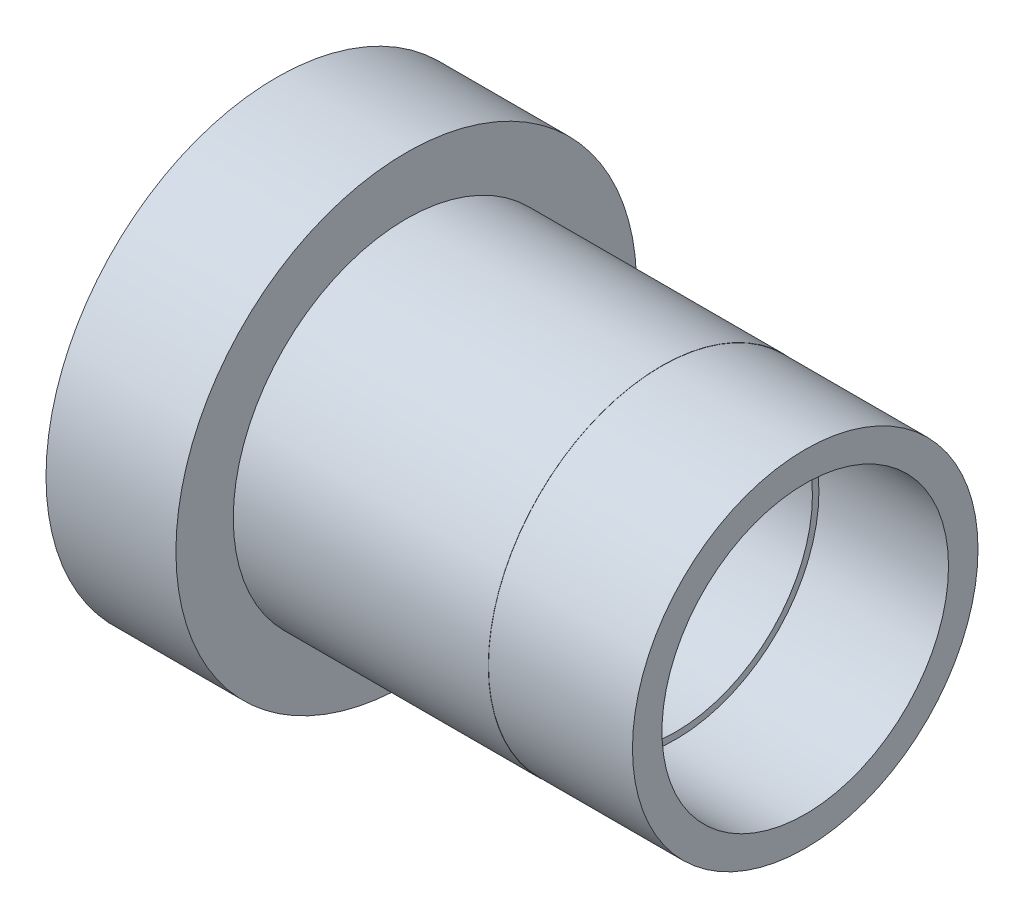
ISO-10303-21;
HEADER;
FILE_DESCRIPTION(('STEP AP214'),'2;1');
FILE_NAME('part.step','',(''),(''),'','','');
FILE_SCHEMA(('AUTOMOTIVE_DESIGN { 1 0 10303 214 1 1 1 1 }'));
ENDSEC;
DATA;
#1=APPLICATION_CONTEXT('core data for automotive mechanical design processes');
#2=APPLICATION_PROTOCOL_DEFINITION('international standard','automotive_design',2000,#1);
#3=PRODUCT_CONTEXT('',#1,'mechanical');
#4=PRODUCT('Part','Part','',(#3));
#5=PRODUCT_RELATED_PRODUCT_CATEGORY('part','',(#4));
#6=PRODUCT_DEFINITION_FORMATION('','',#4);
#7=PRODUCT_DEFINITION_CONTEXT('part definition',#1,'design');
#8=PRODUCT_DEFINITION('design','',#6,#7);
#9=PRODUCT_DEFINITION_SHAPE('','',#8);
#10=(LENGTH_UNIT() NAMED_UNIT(*) SI_UNIT(.MILLI.,.METRE.));
#11=(NAMED_UNIT(*) PLANE_ANGLE_UNIT() SI_UNIT($,.RADIAN.));
#12=(NAMED_UNIT(*) SI_UNIT($,.STERADIAN.) SOLID_ANGLE_UNIT());
#13=UNCERTAINTY_MEASURE_WITH_UNIT(LENGTH_MEASURE(1.E-05),#10,'distance_accuracy_value','');
#14=(GEOMETRIC_REPRESENTATION_CONTEXT(3) GLOBAL_UNCERTAINTY_ASSIGNED_CONTEXT((#13)) GLOBAL_UNIT_ASSIGNED_CONTEXT((#10,
#11,#12)) REPRESENTATION_CONTEXT('',''));
#15=CARTESIAN_POINT('',(0.,0.,0.));
#16=DIRECTION('',(0.,0.,1.));
#17=DIRECTION('',(1.,0.,0.));
#18=AXIS2_PLACEMENT_3D('',#15,#16,#17);
#19=CARTESIAN_POINT('',(0.,0.,0.));
#20=DIRECTION('',(-1.,0.,0.));
#21=DIRECTION('',(0.,0.,1.));
#22=AXIS2_PLACEMENT_3D('',#19,#20,#21);
#23=CYLINDRICAL_SURFACE('',#22,3.7703125);
#24=CARTESIAN_POINT('',(-3.571875,0.,0.));
#25=DIRECTION('',(1.,0.,0.));
#26=DIRECTION('',(0.,0.,-1.));
#27=AXIS2_PLACEMENT_3D('',#24,#25,#26);
#28=CIRCLE('',#27,3.7703125);
#29=CARTESIAN_POINT('',(-3.571875,0.,-3.7703125));
#30=VERTEX_POINT('',#29);
#31=EDGE_CURVE('E46',#30,#30,#28,.T.);
#32=ORIENTED_EDGE('',*,*,#31,.T.);
#33=EDGE_LOOP('',(#32));
#34=FACE_BOUND('',#33,.T.);
#35=CARTESIAN_POINT('',(-11.007725,0.,0.));
#36=DIRECTION('',(-1.,0.,0.));
#37=DIRECTION('',(0.,0.,1.));
#38=AXIS2_PLACEMENT_3D('',#35,#36,#37);
#39=CIRCLE('',#38,3.7703125);
#40=CARTESIAN_POINT('',(-11.007725,0.,3.7703125));
#41=VERTEX_POINT('',#40);
#42=EDGE_CURVE('E34',#41,#41,#39,.F.);
#43=ORIENTED_EDGE('',*,*,#42,.F.);
#44=EDGE_LOOP('',(#43));
#45=FACE_BOUND('',#44,.T.);
#46=ADVANCED_FACE('F30',(#34,#45),#23,.F.);
#47=CARTESIAN_POINT('',(-10.9982,4.76885,0.));
#48=DIRECTION('',(-1.,0.,0.));
#49=DIRECTION('',(0.,0.,1.));
#50=AXIS2_PLACEMENT_3D('',#47,#48,#49);
#51=PLANE('',#50);
#52=CARTESIAN_POINT('',(-10.9982,0.,0.));
#53=DIRECTION('',(-1.,0.,0.));
#54=DIRECTION('',(0.,0.,1.));
#55=AXIS2_PLACEMENT_3D('',#52,#53,#54);
#56=CIRCLE('',#55,6.35);
#57=CARTESIAN_POINT('',(-10.9982,0.,6.35));
#58=VERTEX_POINT('',#57);
#59=EDGE_CURVE('E10',#58,#58,#56,.T.);
#60=ORIENTED_EDGE('',*,*,#59,.F.);
#61=EDGE_LOOP('',(#60));
#62=FACE_BOUND('',#61,.T.);
#63=CARTESIAN_POINT('',(-10.9982,0.,0.));
#64=DIRECTION('',(-1.,0.,0.));
#65=DIRECTION('',(0.,0.,1.));
#66=AXIS2_PLACEMENT_3D('',#63,#64,#65);
#67=CIRCLE('',#66,4.76885);
#68=CARTESIAN_POINT('',(-10.9982,0.,4.76885));
#69=VERTEX_POINT('',#68);
#70=EDGE_CURVE('E67',#69,#69,#67,.T.);
#71=ORIENTED_EDGE('',*,*,#70,.T.);
#72=EDGE_LOOP('',(#71));
#73=FACE_BOUND('',#72,.T.);
#74=ADVANCED_FACE('F32',(#62,#73),#51,.F.);
#75=CARTESIAN_POINT('',(-14.5796,0.,0.));
#76=DIRECTION('',(-1.,0.,0.));
#77=DIRECTION('',(0.,0.,1.));
#78=AXIS2_PLACEMENT_3D('',#75,#76,#77);
#79=CYLINDRICAL_SURFACE('',#78,6.35);
#80=CARTESIAN_POINT('',(-14.5796,0.,0.));
#81=DIRECTION('',(-1.,0.,0.));
#82=DIRECTION('',(0.,0.,1.));
#83=AXIS2_PLACEMENT_3D('',#80,#81,#82);
#84=CIRCLE('',#83,6.35);
#85=CARTESIAN_POINT('',(-14.5796,0.,6.35));
#86=VERTEX_POINT('',#85);
#87=EDGE_CURVE('E38',#86,#86,#84,.T.);
#88=ORIENTED_EDGE('',*,*,#87,.F.);
#89=EDGE_LOOP('',(#88));
#90=FACE_BOUND('',#89,.T.);
#91=ORIENTED_EDGE('',*,*,#59,.T.);
#92=EDGE_LOOP('',(#91));
#93=FACE_BOUND('',#92,.T.);
#94=ADVANCED_FACE('F93',(#90,#93),#79,.T.);
#95=CARTESIAN_POINT('',(-14.5796,6.35,0.));
#96=DIRECTION('',(1.,0.,0.));
#97=DIRECTION('',(0.,0.,-1.));
#98=AXIS2_PLACEMENT_3D('',#95,#96,#97);
#99=PLANE('',#98);
#100=CARTESIAN_POINT('',(-14.5796,0.,0.));
#101=DIRECTION('',(-1.,0.,0.));
#102=DIRECTION('',(0.,0.,1.));
#103=AXIS2_PLACEMENT_3D('',#100,#101,#102);
#104=CIRCLE('',#103,3.9497);
#105=CARTESIAN_POINT('',(-14.5796,0.,3.9497));
#106=VERTEX_POINT('',#105);
#107=EDGE_CURVE('E59',#106,#106,#104,.T.);
#108=ORIENTED_EDGE('',*,*,#107,.F.);
#109=EDGE_LOOP('',(#108));
#110=FACE_BOUND('',#109,.T.);
#111=ORIENTED_EDGE('',*,*,#87,.T.);
#112=EDGE_LOOP('',(#111));
#113=FACE_BOUND('',#112,.T.);
#114=ADVANCED_FACE('F83',(#110,#113),#99,.F.);
#115=CARTESIAN_POINT('',(0.,0.,0.));
#116=DIRECTION('',(-1.,0.,0.));
#117=DIRECTION('',(0.,0.,1.));
#118=AXIS2_PLACEMENT_3D('',#115,#116,#117);
#119=PLANE('',#118);
#120=CARTESIAN_POINT('',(0.,0.,0.));
#121=DIRECTION('',(1.,0.,0.));
#122=DIRECTION('',(0.,0.,-1.));
#123=AXIS2_PLACEMENT_3D('',#120,#121,#122);
#124=CIRCLE('',#123,3.9497);
#125=CARTESIAN_POINT('',(0.,0.,-3.9497));
#126=VERTEX_POINT('',#125);
#127=EDGE_CURVE('E48',#126,#126,#124,.T.);
#128=ORIENTED_EDGE('',*,*,#127,.F.);
#129=EDGE_LOOP('',(#128));
#130=FACE_BOUND('',#129,.T.);
#131=CARTESIAN_POINT('',(0.,0.,0.));
#132=DIRECTION('',(-1.,0.,0.));
#133=DIRECTION('',(0.,0.,1.));
#134=AXIS2_PLACEMENT_3D('',#131,#132,#133);
#135=CIRCLE('',#134,4.7625);
#136=CARTESIAN_POINT('',(0.,0.,4.7625));
#137=VERTEX_POINT('',#136);
#138=EDGE_CURVE('E43',#137,#137,#135,.T.);
#139=ORIENTED_EDGE('',*,*,#138,.F.);
#140=EDGE_LOOP('',(#139));
#141=FACE_BOUND('',#140,.T.);
#142=ADVANCED_FACE('F81',(#130,#141),#119,.F.);
#143=CARTESIAN_POINT('',(-14.5796,0.,0.));
#144=DIRECTION('',(-1.,0.,0.));
#145=DIRECTION('',(0.,0.,1.));
#146=AXIS2_PLACEMENT_3D('',#143,#144,#145);
#147=CYLINDRICAL_SURFACE('',#146,4.7625);
#148=CARTESIAN_POINT('',(-3.96875,0.,0.));
#149=DIRECTION('',(-1.,0.,0.));
#150=DIRECTION('',(0.,0.,1.));
#151=AXIS2_PLACEMENT_3D('',#148,#149,#150);
#152=CIRCLE('',#151,4.7625);
#153=CARTESIAN_POINT('',(-3.96875,0.,4.7625));
#154=VERTEX_POINT('',#153);
#155=EDGE_CURVE('E74',#154,#154,#152,.T.);
#156=ORIENTED_EDGE('',*,*,#155,.F.);
#157=EDGE_LOOP('',(#156));
#158=FACE_BOUND('',#157,.T.);
#159=ORIENTED_EDGE('',*,*,#138,.T.);
#160=EDGE_LOOP('',(#159));
#161=FACE_BOUND('',#160,.T.);
#162=ADVANCED_FACE('F79',(#158,#161),#147,.T.);
#163=CARTESIAN_POINT('',(-3.96875,4.7625,0.));
#164=DIRECTION('',(-1.,0.,0.));
#165=DIRECTION('',(0.,0.,1.));
#166=AXIS2_PLACEMENT_3D('',#163,#164,#165);
#167=PLANE('',#166);
#168=CARTESIAN_POINT('',(-3.96875,0.,0.));
#169=DIRECTION('',(-1.,0.,0.));
#170=DIRECTION('',(0.,0.,1.));
#171=AXIS2_PLACEMENT_3D('',#168,#169,#170);
#172=CIRCLE('',#171,4.76885);
#173=CARTESIAN_POINT('',(-3.96875,0.,4.76885));
#174=VERTEX_POINT('',#173);
#175=EDGE_CURVE('E71',#174,#174,#172,.T.);
#176=ORIENTED_EDGE('',*,*,#175,.F.);
#177=EDGE_LOOP('',(#176));
#178=FACE_BOUND('',#177,.T.);
#179=ORIENTED_EDGE('',*,*,#155,.T.);
#180=EDGE_LOOP('',(#179));
#181=FACE_BOUND('',#180,.T.);
#182=ADVANCED_FACE('F90',(#178,#181),#167,.F.);
#183=CARTESIAN_POINT('',(-14.5796,0.,0.));
#184=DIRECTION('',(-1.,0.,0.));
#185=DIRECTION('',(0.,0.,1.));
#186=AXIS2_PLACEMENT_3D('',#183,#184,#185);
#187=CYLINDRICAL_SURFACE('',#186,4.76885);
#188=ORIENTED_EDGE('',*,*,#70,.F.);
#189=EDGE_LOOP('',(#188));
#190=FACE_BOUND('',#189,.T.);
#191=ORIENTED_EDGE('',*,*,#175,.T.);
#192=EDGE_LOOP('',(#191));
#193=FACE_BOUND('',#192,.T.);
#194=ADVANCED_FACE('F116',(#190,#193),#187,.T.);
#195=CARTESIAN_POINT('',(-3.571875,0.,0.));
#196=DIRECTION('',(1.,0.,0.));
#197=DIRECTION('',(0.,0.,-1.));
#198=AXIS2_PLACEMENT_3D('',#195,#196,#197);
#199=CYLINDRICAL_SURFACE('',#198,3.9497);
#200=CARTESIAN_POINT('',(-3.571875,0.,0.));
#201=DIRECTION('',(1.,0.,0.));
#202=DIRECTION('',(0.,0.,-1.));
#203=AXIS2_PLACEMENT_3D('',#200,#201,#202);
#204=CIRCLE('',#203,3.9497);
#205=CARTESIAN_POINT('',(-3.571875,0.,-3.9497));
#206=VERTEX_POINT('',#205);
#207=EDGE_CURVE('E52',#206,#206,#204,.T.);
#208=ORIENTED_EDGE('',*,*,#207,.F.);
#209=EDGE_LOOP('',(#208));
#210=FACE_BOUND('',#209,.T.);
#211=ORIENTED_EDGE('',*,*,#127,.T.);
#212=EDGE_LOOP('',(#211));
#213=FACE_BOUND('',#212,.T.);
#214=ADVANCED_FACE('F112',(#210,#213),#199,.F.);
#215=CARTESIAN_POINT('',(-3.571875,0.,0.));
#216=DIRECTION('',(1.,0.,0.));
#217=DIRECTION('',(0.,0.,-1.));
#218=AXIS2_PLACEMENT_3D('',#215,#216,#217);
#219=PLANE('',#218);
#220=ORIENTED_EDGE('',*,*,#31,.F.);
#221=EDGE_LOOP('',(#220));
#222=FACE_BOUND('',#221,.T.);
#223=ORIENTED_EDGE('',*,*,#207,.T.);
#224=EDGE_LOOP('',(#223));
#225=FACE_BOUND('',#224,.T.);
#226=ADVANCED_FACE('F108',(#222,#225),#219,.T.);
#227=CARTESIAN_POINT('',(-11.007725,0.,0.));
#228=DIRECTION('',(-1.,0.,0.));
#229=DIRECTION('',(0.,0.,1.));
#230=AXIS2_PLACEMENT_3D('',#227,#228,#229);
#231=PLANE('',#230);
#232=CARTESIAN_POINT('',(-11.007725,0.,0.));
#233=DIRECTION('',(-1.,0.,0.));
#234=DIRECTION('',(0.,0.,1.));
#235=AXIS2_PLACEMENT_3D('',#232,#233,#234);
#236=CIRCLE('',#235,3.9497);
#237=CARTESIAN_POINT('',(-11.007725,0.,3.9497));
#238=VERTEX_POINT('',#237);
#239=EDGE_CURVE('E55',#238,#238,#236,.T.);
#240=ORIENTED_EDGE('',*,*,#239,.T.);
#241=EDGE_LOOP('',(#240));
#242=FACE_BOUND('',#241,.T.);
#243=ORIENTED_EDGE('',*,*,#42,.T.);
#244=EDGE_LOOP('',(#243));
#245=FACE_BOUND('',#244,.T.);
#246=ADVANCED_FACE('F111',(#242,#245),#231,.T.);
#247=CARTESIAN_POINT('',(-11.007725,0.,0.));
#248=DIRECTION('',(-1.,0.,0.));
#249=DIRECTION('',(0.,0.,1.));
#250=AXIS2_PLACEMENT_3D('',#247,#248,#249);
#251=CYLINDRICAL_SURFACE('',#250,3.9497);
#252=ORIENTED_EDGE('',*,*,#239,.F.);
#253=EDGE_LOOP('',(#252));
#254=FACE_BOUND('',#253,.T.);
#255=ORIENTED_EDGE('',*,*,#107,.T.);
#256=EDGE_LOOP('',(#255));
#257=FACE_BOUND('',#256,.T.);
#258=ADVANCED_FACE('F106',(#254,#257),#251,.F.);
#259=CLOSED_SHELL('',(#46,#74,#94,#114,#142,#162,#182,#194,#214,#226,#246,#258));
#260=MANIFOLD_SOLID_BREP('B2',#259);
#261=ADVANCED_BREP_SHAPE_REPRESENTATION('',(#18,#260),#14);
#262=SHAPE_DEFINITION_REPRESENTATION(#9,#261);
ENDSEC;
END-ISO-10303-21;
